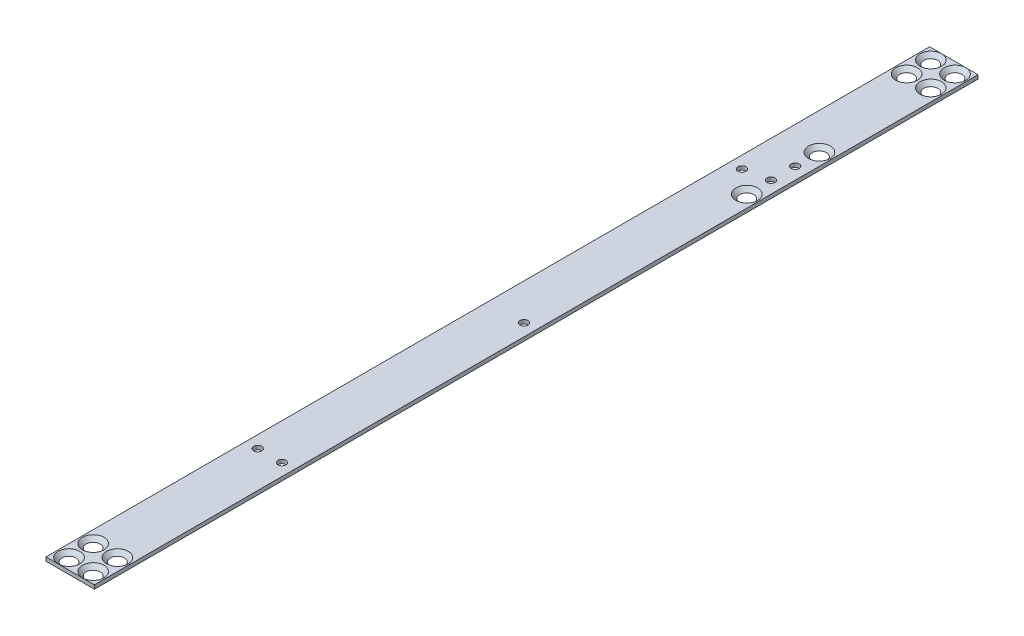
ISO-10303-21;
HEADER;
FILE_DESCRIPTION(('STEP AP214'),'2;1');
FILE_NAME('part.step','',(''),(''),'','','');
FILE_SCHEMA(('AUTOMOTIVE_DESIGN { 1 0 10303 214 1 1 1 1 }'));
ENDSEC;
DATA;
#1=APPLICATION_CONTEXT('core data for automotive mechanical design processes');
#2=APPLICATION_PROTOCOL_DEFINITION('international standard','automotive_design',2000,#1);
#3=PRODUCT_CONTEXT('',#1,'mechanical');
#4=PRODUCT('Part','Part','',(#3));
#5=PRODUCT_RELATED_PRODUCT_CATEGORY('part','',(#4));
#6=PRODUCT_DEFINITION_FORMATION('','',#4);
#7=PRODUCT_DEFINITION_CONTEXT('part definition',#1,'design');
#8=PRODUCT_DEFINITION('design','',#6,#7);
#9=PRODUCT_DEFINITION_SHAPE('','',#8);
#10=(LENGTH_UNIT() NAMED_UNIT(*) SI_UNIT(.MILLI.,.METRE.));
#11=(NAMED_UNIT(*) PLANE_ANGLE_UNIT() SI_UNIT($,.RADIAN.));
#12=(NAMED_UNIT(*) SI_UNIT($,.STERADIAN.) SOLID_ANGLE_UNIT());
#13=UNCERTAINTY_MEASURE_WITH_UNIT(LENGTH_MEASURE(1.E-05),#10,'distance_accuracy_value','');
#14=(GEOMETRIC_REPRESENTATION_CONTEXT(3) GLOBAL_UNCERTAINTY_ASSIGNED_CONTEXT((#13)) GLOBAL_UNIT_ASSIGNED_CONTEXT((#10,
#11,#12)) REPRESENTATION_CONTEXT('',''));
#15=CARTESIAN_POINT('',(0.,0.,0.));
#16=DIRECTION('',(0.,0.,1.));
#17=DIRECTION('',(1.,0.,0.));
#18=AXIS2_PLACEMENT_3D('',#15,#16,#17);
#19=CARTESIAN_POINT('',(0.,1.5875,0.));
#20=DIRECTION('',(0.,-1.,0.));
#21=DIRECTION('',(0.,0.,-1.));
#22=AXIS2_PLACEMENT_3D('',#19,#20,#21);
#23=PLANE('',#22);
#24=CARTESIAN_POINT('',(-5.,1.5875,-100.));
#25=DIRECTION('',(0.,1.,0.));
#26=DIRECTION('',(0.,0.,1.));
#27=AXIS2_PLACEMENT_3D('',#24,#25,#26);
#28=CIRCLE('',#27,1.65);
#29=CARTESIAN_POINT('',(-5.,1.5875,-98.35));
#30=VERTEX_POINT('',#29);
#31=EDGE_CURVE('E307',#30,#30,#28,.T.);
#32=ORIENTED_EDGE('',*,*,#31,.F.);
#33=EDGE_LOOP('',(#32));
#34=FACE_BOUND('',#33,.T.);
#35=CARTESIAN_POINT('',(5.,1.5875,0.));
#36=DIRECTION('',(0.,1.,0.));
#37=DIRECTION('',(0.,0.,1.));
#38=AXIS2_PLACEMENT_3D('',#35,#36,#37);
#39=CIRCLE('',#38,1.65);
#40=CARTESIAN_POINT('',(5.,1.5875,1.65));
#41=VERTEX_POINT('',#40);
#42=EDGE_CURVE('E268',#41,#41,#39,.T.);
#43=ORIENTED_EDGE('',*,*,#42,.F.);
#44=EDGE_LOOP('',(#43));
#45=FACE_BOUND('',#44,.T.);
#46=CARTESIAN_POINT('',(5.,1.5875,-112.));
#47=DIRECTION('',(0.,1.,0.));
#48=DIRECTION('',(0.,0.,1.));
#49=AXIS2_PLACEMENT_3D('',#46,#47,#48);
#50=CIRCLE('',#49,1.65);
#51=CARTESIAN_POINT('',(5.,1.5875,-110.35));
#52=VERTEX_POINT('',#51);
#53=EDGE_CURVE('E281',#52,#52,#50,.T.);
#54=ORIENTED_EDGE('',*,*,#53,.F.);
#55=EDGE_LOOP('',(#54));
#56=FACE_BOUND('',#55,.T.);
#57=CARTESIAN_POINT('',(-5.00000000000001,1.5875,168.));
#58=DIRECTION('',(0.,1.,0.));
#59=DIRECTION('',(0.,0.,1.));
#60=AXIS2_PLACEMENT_3D('',#57,#58,#59);
#61=CIRCLE('',#60,4.48);
#62=CARTESIAN_POINT('',(-5.00000000000001,1.5875,172.48));
#63=VERTEX_POINT('',#62);
#64=EDGE_CURVE('E147',#63,#63,#61,.T.);
#65=ORIENTED_EDGE('',*,*,#64,.F.);
#66=EDGE_LOOP('',(#65));
#67=FACE_BOUND('',#66,.T.);
#68=CARTESIAN_POINT('',(5.,1.5875,178.));
#69=DIRECTION('',(0.,1.,0.));
#70=DIRECTION('',(0.,0.,1.));
#71=AXIS2_PLACEMENT_3D('',#68,#69,#70);
#72=CIRCLE('',#71,4.48);
#73=CARTESIAN_POINT('',(5.,1.5875,182.48));
#74=VERTEX_POINT('',#73);
#75=EDGE_CURVE('E143',#74,#74,#72,.T.);
#76=ORIENTED_EDGE('',*,*,#75,.F.);
#77=EDGE_LOOP('',(#76));
#78=FACE_BOUND('',#77,.T.);
#79=CARTESIAN_POINT('',(-5.00000000000001,1.5875,-168.));
#80=DIRECTION('',(0.,1.,0.));
#81=DIRECTION('',(0.,0.,1.));
#82=AXIS2_PLACEMENT_3D('',#79,#80,#81);
#83=CIRCLE('',#82,4.48);
#84=CARTESIAN_POINT('',(-5.00000000000001,1.5875,-163.52));
#85=VERTEX_POINT('',#84);
#86=EDGE_CURVE('E179',#85,#85,#83,.T.);
#87=ORIENTED_EDGE('',*,*,#86,.F.);
#88=EDGE_LOOP('',(#87));
#89=FACE_BOUND('',#88,.T.);
#90=CARTESIAN_POINT('',(-5.00000000000001,1.5875,-178.));
#91=DIRECTION('',(0.,1.,0.));
#92=DIRECTION('',(0.,0.,1.));
#93=AXIS2_PLACEMENT_3D('',#90,#91,#92);
#94=CIRCLE('',#93,4.48);
#95=CARTESIAN_POINT('',(-5.00000000000001,1.5875,-173.52));
#96=VERTEX_POINT('',#95);
#97=EDGE_CURVE('E187',#96,#96,#94,.T.);
#98=ORIENTED_EDGE('',*,*,#97,.F.);
#99=EDGE_LOOP('',(#98));
#100=FACE_BOUND('',#99,.T.);
#101=CARTESIAN_POINT('',(5.,1.5875,-168.));
#102=DIRECTION('',(0.,1.,0.));
#103=DIRECTION('',(0.,0.,1.));
#104=AXIS2_PLACEMENT_3D('',#101,#102,#103);
#105=CIRCLE('',#104,4.48);
#106=CARTESIAN_POINT('',(5.,1.5875,-163.52));
#107=VERTEX_POINT('',#106);
#108=EDGE_CURVE('E195',#107,#107,#105,.T.);
#109=ORIENTED_EDGE('',*,*,#108,.F.);
#110=EDGE_LOOP('',(#109));
#111=FACE_BOUND('',#110,.T.);
#112=CARTESIAN_POINT('',(5.,1.5875,-122.));
#113=DIRECTION('',(0.,1.,0.));
#114=DIRECTION('',(0.,0.,1.));
#115=AXIS2_PLACEMENT_3D('',#112,#113,#114);
#116=CIRCLE('',#115,4.48);
#117=CARTESIAN_POINT('',(5.,1.5875,-117.52));
#118=VERTEX_POINT('',#117);
#119=EDGE_CURVE('E133',#118,#118,#116,.T.);
#120=ORIENTED_EDGE('',*,*,#119,.F.);
#121=EDGE_LOOP('',(#120));
#122=FACE_BOUND('',#121,.T.);
#123=DIRECTION('',(0.,0.,-1.));
#124=VECTOR('',#123,1.);
#125=CARTESIAN_POINT('',(10.,1.5875,182.5));
#126=LINE('',#125,#124);
#127=CARTESIAN_POINT('',(10.,1.5875,182.5));
#128=VERTEX_POINT('',#127);
#129=CARTESIAN_POINT('',(10.,1.5875,-182.5));
#130=VERTEX_POINT('',#129);
#131=EDGE_CURVE('E98',#128,#130,#126,.T.);
#132=ORIENTED_EDGE('',*,*,#131,.T.);
#133=DIRECTION('',(-1.,0.,0.));
#134=VECTOR('',#133,1.);
#135=CARTESIAN_POINT('',(-10.,1.5875,-182.5));
#136=LINE('',#135,#134);
#137=CARTESIAN_POINT('',(-10.,1.5875,-182.5));
#138=VERTEX_POINT('',#137);
#139=EDGE_CURVE('E93',#130,#138,#136,.T.);
#140=ORIENTED_EDGE('',*,*,#139,.T.);
#141=DIRECTION('',(0.,0.,1.));
#142=VECTOR('',#141,1.);
#143=CARTESIAN_POINT('',(-10.,1.5875,182.5));
#144=LINE('',#143,#142);
#145=CARTESIAN_POINT('',(-10.,1.5875,182.5));
#146=VERTEX_POINT('',#145);
#147=EDGE_CURVE('E96',#138,#146,#144,.T.);
#148=ORIENTED_EDGE('',*,*,#147,.T.);
#149=DIRECTION('',(1.,0.,0.));
#150=VECTOR('',#149,1.);
#151=CARTESIAN_POINT('',(-10.,1.5875,182.5));
#152=LINE('',#151,#150);
#153=EDGE_CURVE('E63',#146,#128,#152,.T.);
#154=ORIENTED_EDGE('',*,*,#153,.T.);
#155=EDGE_LOOP('',(#132,#140,#148,#154));
#156=FACE_BOUND('',#155,.T.);
#157=CARTESIAN_POINT('',(5.,1.5875,-92.));
#158=DIRECTION('',(0.,1.,0.));
#159=DIRECTION('',(0.,0.,1.));
#160=AXIS2_PLACEMENT_3D('',#157,#158,#159);
#161=CIRCLE('',#160,4.48);
#162=CARTESIAN_POINT('',(5.,1.5875,-87.52));
#163=VERTEX_POINT('',#162);
#164=EDGE_CURVE('E138',#163,#163,#161,.T.);
#165=ORIENTED_EDGE('',*,*,#164,.F.);
#166=EDGE_LOOP('',(#165));
#167=FACE_BOUND('',#166,.T.);
#168=CARTESIAN_POINT('',(5.,1.5875,-178.));
#169=DIRECTION('',(0.,1.,0.));
#170=DIRECTION('',(0.,0.,1.));
#171=AXIS2_PLACEMENT_3D('',#168,#169,#170);
#172=CIRCLE('',#171,4.48);
#173=CARTESIAN_POINT('',(5.,1.5875,-173.52));
#174=VERTEX_POINT('',#173);
#175=EDGE_CURVE('E142',#174,#174,#172,.T.);
#176=ORIENTED_EDGE('',*,*,#175,.F.);
#177=EDGE_LOOP('',(#176));
#178=FACE_BOUND('',#177,.T.);
#179=CARTESIAN_POINT('',(-5.00000000000001,1.5875,178.));
#180=DIRECTION('',(0.,1.,0.));
#181=DIRECTION('',(0.,0.,1.));
#182=AXIS2_PLACEMENT_3D('',#179,#180,#181);
#183=CIRCLE('',#182,4.48);
#184=CARTESIAN_POINT('',(-5.00000000000001,1.5875,182.48));
#185=VERTEX_POINT('',#184);
#186=EDGE_CURVE('E148',#185,#185,#183,.T.);
#187=ORIENTED_EDGE('',*,*,#186,.F.);
#188=EDGE_LOOP('',(#187));
#189=FACE_BOUND('',#188,.T.);
#190=CARTESIAN_POINT('',(5.,1.5875,168.));
#191=DIRECTION('',(0.,1.,0.));
#192=DIRECTION('',(0.,0.,1.));
#193=AXIS2_PLACEMENT_3D('',#190,#191,#192);
#194=CIRCLE('',#193,4.48);
#195=CARTESIAN_POINT('',(5.,1.5875,172.48));
#196=VERTEX_POINT('',#195);
#197=EDGE_CURVE('E162',#196,#196,#194,.T.);
#198=ORIENTED_EDGE('',*,*,#197,.F.);
#199=EDGE_LOOP('',(#198));
#200=FACE_BOUND('',#199,.T.);
#201=CARTESIAN_POINT('',(5.,1.5875,-102.));
#202=DIRECTION('',(0.,1.,0.));
#203=DIRECTION('',(0.,0.,1.));
#204=AXIS2_PLACEMENT_3D('',#201,#202,#203);
#205=CIRCLE('',#204,1.65);
#206=CARTESIAN_POINT('',(5.,1.5875,-100.35));
#207=VERTEX_POINT('',#206);
#208=EDGE_CURVE('E267',#207,#207,#205,.T.);
#209=ORIENTED_EDGE('',*,*,#208,.F.);
#210=EDGE_LOOP('',(#209));
#211=FACE_BOUND('',#210,.T.);
#212=CARTESIAN_POINT('',(5.,1.5875,100.));
#213=DIRECTION('',(0.,1.,0.));
#214=DIRECTION('',(0.,0.,1.));
#215=AXIS2_PLACEMENT_3D('',#212,#213,#214);
#216=CIRCLE('',#215,1.65);
#217=CARTESIAN_POINT('',(5.,1.5875,101.65));
#218=VERTEX_POINT('',#217);
#219=EDGE_CURVE('E297',#218,#218,#216,.T.);
#220=ORIENTED_EDGE('',*,*,#219,.F.);
#221=EDGE_LOOP('',(#220));
#222=FACE_BOUND('',#221,.T.);
#223=CARTESIAN_POINT('',(-5.,1.5875,100.));
#224=DIRECTION('',(0.,1.,0.));
#225=DIRECTION('',(0.,0.,1.));
#226=AXIS2_PLACEMENT_3D('',#223,#224,#225);
#227=CIRCLE('',#226,1.65);
#228=CARTESIAN_POINT('',(-5.,1.5875,101.65));
#229=VERTEX_POINT('',#228);
#230=EDGE_CURVE('E300',#229,#229,#227,.T.);
#231=ORIENTED_EDGE('',*,*,#230,.F.);
#232=EDGE_LOOP('',(#231));
#233=FACE_BOUND('',#232,.T.);
#234=ADVANCED_FACE('F43',(#34,#45,#56,#67,#78,#89,#100,#111,#122,#156,#167,#178,#189,#200,#211,
#222,#233),#23,.F.);
#235=CARTESIAN_POINT('',(0.,0.,0.));
#236=DIRECTION('',(0.,-1.,0.));
#237=DIRECTION('',(0.,0.,-1.));
#238=AXIS2_PLACEMENT_3D('',#235,#236,#237);
#239=PLANE('',#238);
#240=CARTESIAN_POINT('',(-5.,0.,100.));
#241=DIRECTION('',(0.,1.,0.));
#242=DIRECTION('',(0.,0.,1.));
#243=AXIS2_PLACEMENT_3D('',#240,#241,#242);
#244=CIRCLE('',#243,1.65);
#245=CARTESIAN_POINT('',(-5.,0.,101.65));
#246=VERTEX_POINT('',#245);
#247=EDGE_CURVE('E303',#246,#246,#244,.T.);
#248=ORIENTED_EDGE('',*,*,#247,.T.);
#249=EDGE_LOOP('',(#248));
#250=FACE_BOUND('',#249,.T.);
#251=CARTESIAN_POINT('',(-5.,0.,-100.));
#252=DIRECTION('',(0.,1.,0.));
#253=DIRECTION('',(0.,0.,1.));
#254=AXIS2_PLACEMENT_3D('',#251,#252,#253);
#255=CIRCLE('',#254,1.65);
#256=CARTESIAN_POINT('',(-5.,0.,-98.35));
#257=VERTEX_POINT('',#256);
#258=EDGE_CURVE('E313',#257,#257,#255,.T.);
#259=ORIENTED_EDGE('',*,*,#258,.T.);
#260=EDGE_LOOP('',(#259));
#261=FACE_BOUND('',#260,.T.);
#262=CARTESIAN_POINT('',(5.,0.,100.));
#263=DIRECTION('',(0.,1.,0.));
#264=DIRECTION('',(0.,0.,1.));
#265=AXIS2_PLACEMENT_3D('',#262,#263,#264);
#266=CIRCLE('',#265,1.65);
#267=CARTESIAN_POINT('',(5.,0.,101.65));
#268=VERTEX_POINT('',#267);
#269=EDGE_CURVE('E275',#268,#268,#266,.T.);
#270=ORIENTED_EDGE('',*,*,#269,.T.);
#271=EDGE_LOOP('',(#270));
#272=FACE_BOUND('',#271,.T.);
#273=CARTESIAN_POINT('',(5.,0.,178.));
#274=DIRECTION('',(0.,-1.,0.));
#275=DIRECTION('',(0.,0.,-1.));
#276=AXIS2_PLACEMENT_3D('',#273,#274,#275);
#277=CIRCLE('',#276,2.8925);
#278=CARTESIAN_POINT('',(5.,0.,175.1075));
#279=VERTEX_POINT('',#278);
#280=EDGE_CURVE('E139',#279,#279,#277,.T.);
#281=ORIENTED_EDGE('',*,*,#280,.F.);
#282=EDGE_LOOP('',(#281));
#283=FACE_BOUND('',#282,.T.);
#284=CARTESIAN_POINT('',(5.,0.,-168.));
#285=DIRECTION('',(0.,-1.,0.));
#286=DIRECTION('',(0.,0.,-1.));
#287=AXIS2_PLACEMENT_3D('',#284,#285,#286);
#288=CIRCLE('',#287,2.8925);
#289=CARTESIAN_POINT('',(5.,0.,-170.8925));
#290=VERTEX_POINT('',#289);
#291=EDGE_CURVE('E199',#290,#290,#288,.T.);
#292=ORIENTED_EDGE('',*,*,#291,.F.);
#293=EDGE_LOOP('',(#292));
#294=FACE_BOUND('',#293,.T.);
#295=CARTESIAN_POINT('',(5.,0.,-122.));
#296=DIRECTION('',(0.,-1.,0.));
#297=DIRECTION('',(0.,0.,-1.));
#298=AXIS2_PLACEMENT_3D('',#295,#296,#297);
#299=CIRCLE('',#298,2.8925);
#300=CARTESIAN_POINT('',(5.,0.,-124.8925));
#301=VERTEX_POINT('',#300);
#302=EDGE_CURVE('E119',#301,#301,#299,.T.);
#303=ORIENTED_EDGE('',*,*,#302,.F.);
#304=EDGE_LOOP('',(#303));
#305=FACE_BOUND('',#304,.T.);
#306=DIRECTION('',(0.,0.,-1.));
#307=VECTOR('',#306,1.);
#308=CARTESIAN_POINT('',(10.,0.,182.5));
#309=LINE('',#308,#307);
#310=CARTESIAN_POINT('',(10.,0.,182.5));
#311=VERTEX_POINT('',#310);
#312=CARTESIAN_POINT('',(10.,0.,-182.5));
#313=VERTEX_POINT('',#312);
#314=EDGE_CURVE('E115',#311,#313,#309,.T.);
#315=ORIENTED_EDGE('',*,*,#314,.F.);
#316=DIRECTION('',(1.,0.,0.));
#317=VECTOR('',#316,1.);
#318=CARTESIAN_POINT('',(-10.,0.,182.5));
#319=LINE('',#318,#317);
#320=CARTESIAN_POINT('',(-10.,0.,182.5));
#321=VERTEX_POINT('',#320);
#322=EDGE_CURVE('E86',#321,#311,#319,.T.);
#323=ORIENTED_EDGE('',*,*,#322,.F.);
#324=DIRECTION('',(0.,0.,1.));
#325=VECTOR('',#324,1.);
#326=CARTESIAN_POINT('',(-10.,0.,182.5));
#327=LINE('',#326,#325);
#328=CARTESIAN_POINT('',(-10.,0.,-182.5));
#329=VERTEX_POINT('',#328);
#330=EDGE_CURVE('E80',#329,#321,#327,.T.);
#331=ORIENTED_EDGE('',*,*,#330,.F.);
#332=DIRECTION('',(-1.,0.,0.));
#333=VECTOR('',#332,1.);
#334=CARTESIAN_POINT('',(-10.,0.,-182.5));
#335=LINE('',#334,#333);
#336=EDGE_CURVE('E103',#313,#329,#335,.T.);
#337=ORIENTED_EDGE('',*,*,#336,.F.);
#338=EDGE_LOOP('',(#315,#323,#331,#337));
#339=FACE_BOUND('',#338,.T.);
#340=CARTESIAN_POINT('',(5.,0.,-92.));
#341=DIRECTION('',(0.,-1.,0.));
#342=DIRECTION('',(0.,0.,-1.));
#343=AXIS2_PLACEMENT_3D('',#340,#341,#342);
#344=CIRCLE('',#343,2.8925);
#345=CARTESIAN_POINT('',(5.,0.,-94.8925));
#346=VERTEX_POINT('',#345);
#347=EDGE_CURVE('E134',#346,#346,#344,.T.);
#348=ORIENTED_EDGE('',*,*,#347,.F.);
#349=EDGE_LOOP('',(#348));
#350=FACE_BOUND('',#349,.T.);
#351=CARTESIAN_POINT('',(-5.00000000000001,0.,-178.));
#352=DIRECTION('',(0.,-1.,0.));
#353=DIRECTION('',(0.,0.,-1.));
#354=AXIS2_PLACEMENT_3D('',#351,#352,#353);
#355=CIRCLE('',#354,2.8925);
#356=CARTESIAN_POINT('',(-5.00000000000001,0.,-180.8925));
#357=VERTEX_POINT('',#356);
#358=EDGE_CURVE('E191',#357,#357,#355,.T.);
#359=ORIENTED_EDGE('',*,*,#358,.F.);
#360=EDGE_LOOP('',(#359));
#361=FACE_BOUND('',#360,.T.);
#362=CARTESIAN_POINT('',(-5.00000000000001,0.,-168.));
#363=DIRECTION('',(0.,-1.,0.));
#364=DIRECTION('',(0.,0.,-1.));
#365=AXIS2_PLACEMENT_3D('',#362,#363,#364);
#366=CIRCLE('',#365,2.8925);
#367=CARTESIAN_POINT('',(-5.00000000000001,0.,-170.8925));
#368=VERTEX_POINT('',#367);
#369=EDGE_CURVE('E183',#368,#368,#366,.T.);
#370=ORIENTED_EDGE('',*,*,#369,.F.);
#371=EDGE_LOOP('',(#370));
#372=FACE_BOUND('',#371,.T.);
#373=CARTESIAN_POINT('',(5.,0.,-178.));
#374=DIRECTION('',(0.,-1.,0.));
#375=DIRECTION('',(0.,0.,-1.));
#376=AXIS2_PLACEMENT_3D('',#373,#374,#375);
#377=CIRCLE('',#376,2.8925);
#378=CARTESIAN_POINT('',(5.,0.,-180.8925));
#379=VERTEX_POINT('',#378);
#380=EDGE_CURVE('E175',#379,#379,#377,.T.);
#381=ORIENTED_EDGE('',*,*,#380,.F.);
#382=EDGE_LOOP('',(#381));
#383=FACE_BOUND('',#382,.T.);
#384=CARTESIAN_POINT('',(-5.00000000000001,0.,168.));
#385=DIRECTION('',(0.,-1.,0.));
#386=DIRECTION('',(0.,0.,-1.));
#387=AXIS2_PLACEMENT_3D('',#384,#385,#386);
#388=CIRCLE('',#387,2.8925);
#389=CARTESIAN_POINT('',(-5.00000000000001,0.,165.1075));
#390=VERTEX_POINT('',#389);
#391=EDGE_CURVE('E154',#390,#390,#388,.T.);
#392=ORIENTED_EDGE('',*,*,#391,.F.);
#393=EDGE_LOOP('',(#392));
#394=FACE_BOUND('',#393,.T.);
#395=CARTESIAN_POINT('',(-5.00000000000001,0.,178.));
#396=DIRECTION('',(0.,-1.,0.));
#397=DIRECTION('',(0.,0.,-1.));
#398=AXIS2_PLACEMENT_3D('',#395,#396,#397);
#399=CIRCLE('',#398,2.8925);
#400=CARTESIAN_POINT('',(-5.00000000000001,0.,175.1075));
#401=VERTEX_POINT('',#400);
#402=EDGE_CURVE('E144',#401,#401,#399,.T.);
#403=ORIENTED_EDGE('',*,*,#402,.F.);
#404=EDGE_LOOP('',(#403));
#405=FACE_BOUND('',#404,.T.);
#406=CARTESIAN_POINT('',(5.,0.,168.));
#407=DIRECTION('',(0.,-1.,0.));
#408=DIRECTION('',(0.,0.,-1.));
#409=AXIS2_PLACEMENT_3D('',#406,#407,#408);
#410=CIRCLE('',#409,2.8925);
#411=CARTESIAN_POINT('',(5.,0.,165.1075));
#412=VERTEX_POINT('',#411);
#413=EDGE_CURVE('E47',#412,#412,#410,.T.);
#414=ORIENTED_EDGE('',*,*,#413,.F.);
#415=EDGE_LOOP('',(#414));
#416=FACE_BOUND('',#415,.T.);
#417=CARTESIAN_POINT('',(5.,0.,-112.));
#418=DIRECTION('',(0.,1.,0.));
#419=DIRECTION('',(0.,0.,1.));
#420=AXIS2_PLACEMENT_3D('',#417,#418,#419);
#421=CIRCLE('',#420,1.65);
#422=CARTESIAN_POINT('',(5.,0.,-110.35));
#423=VERTEX_POINT('',#422);
#424=EDGE_CURVE('E257',#423,#423,#421,.T.);
#425=ORIENTED_EDGE('',*,*,#424,.T.);
#426=EDGE_LOOP('',(#425));
#427=FACE_BOUND('',#426,.T.);
#428=CARTESIAN_POINT('',(5.,0.,-102.));
#429=DIRECTION('',(0.,1.,0.));
#430=DIRECTION('',(0.,0.,1.));
#431=AXIS2_PLACEMENT_3D('',#428,#429,#430);
#432=CIRCLE('',#431,1.65);
#433=CARTESIAN_POINT('',(5.,0.,-100.35));
#434=VERTEX_POINT('',#433);
#435=EDGE_CURVE('E261',#434,#434,#432,.T.);
#436=ORIENTED_EDGE('',*,*,#435,.T.);
#437=EDGE_LOOP('',(#436));
#438=FACE_BOUND('',#437,.T.);
#439=CARTESIAN_POINT('',(5.,0.,0.));
#440=DIRECTION('',(0.,1.,0.));
#441=DIRECTION('',(0.,0.,1.));
#442=AXIS2_PLACEMENT_3D('',#439,#440,#441);
#443=CIRCLE('',#442,1.65);
#444=CARTESIAN_POINT('',(5.,0.,1.65));
#445=VERTEX_POINT('',#444);
#446=EDGE_CURVE('E264',#445,#445,#443,.T.);
#447=ORIENTED_EDGE('',*,*,#446,.T.);
#448=EDGE_LOOP('',(#447));
#449=FACE_BOUND('',#448,.T.);
#450=ADVANCED_FACE('F214',(#250,#261,#272,#283,#294,#305,#339,#350,#361,#372,#383,#394,#405,
#416,#427,#438,#449),#239,.T.);
#451=CARTESIAN_POINT('',(10.,1.5875,182.5));
#452=DIRECTION('',(-1.,0.,0.));
#453=DIRECTION('',(0.,0.,1.));
#454=AXIS2_PLACEMENT_3D('',#451,#452,#453);
#455=PLANE('',#454);
#456=ORIENTED_EDGE('',*,*,#314,.T.);
#457=DIRECTION('',(0.,-1.,0.));
#458=VECTOR('',#457,1.);
#459=CARTESIAN_POINT('',(10.,1.5875,-182.5));
#460=LINE('',#459,#458);
#461=EDGE_CURVE('E11',#130,#313,#460,.T.);
#462=ORIENTED_EDGE('',*,*,#461,.F.);
#463=ORIENTED_EDGE('',*,*,#131,.F.);
#464=DIRECTION('',(0.,-1.,0.));
#465=VECTOR('',#464,1.);
#466=CARTESIAN_POINT('',(10.,1.5875,182.5));
#467=LINE('',#466,#465);
#468=EDGE_CURVE('E111',#128,#311,#467,.T.);
#469=ORIENTED_EDGE('',*,*,#468,.T.);
#470=EDGE_LOOP('',(#456,#462,#463,#469));
#471=FACE_BOUND('',#470,.T.);
#472=ADVANCED_FACE('F45',(#471),#455,.F.);
#473=CARTESIAN_POINT('',(-10.,1.5875,-182.5));
#474=DIRECTION('',(0.,0.,1.));
#475=DIRECTION('',(1.,0.,0.));
#476=AXIS2_PLACEMENT_3D('',#473,#474,#475);
#477=PLANE('',#476);
#478=ORIENTED_EDGE('',*,*,#336,.T.);
#479=DIRECTION('',(0.,-1.,0.));
#480=VECTOR('',#479,1.);
#481=CARTESIAN_POINT('',(-10.,1.5875,-182.5));
#482=LINE('',#481,#480);
#483=EDGE_CURVE('E54',#138,#329,#482,.T.);
#484=ORIENTED_EDGE('',*,*,#483,.F.);
#485=ORIENTED_EDGE('',*,*,#139,.F.);
#486=ORIENTED_EDGE('',*,*,#461,.T.);
#487=EDGE_LOOP('',(#478,#484,#485,#486));
#488=FACE_BOUND('',#487,.T.);
#489=ADVANCED_FACE('F102',(#488),#477,.F.);
#490=CARTESIAN_POINT('',(-10.,1.5875,182.5));
#491=DIRECTION('',(1.,0.,0.));
#492=DIRECTION('',(0.,0.,-1.));
#493=AXIS2_PLACEMENT_3D('',#490,#491,#492);
#494=PLANE('',#493);
#495=ORIENTED_EDGE('',*,*,#330,.T.);
#496=DIRECTION('',(0.,-1.,0.));
#497=VECTOR('',#496,1.);
#498=CARTESIAN_POINT('',(-10.,1.5875,182.5));
#499=LINE('',#498,#497);
#500=EDGE_CURVE('E105',#146,#321,#499,.T.);
#501=ORIENTED_EDGE('',*,*,#500,.F.);
#502=ORIENTED_EDGE('',*,*,#147,.F.);
#503=ORIENTED_EDGE('',*,*,#483,.T.);
#504=EDGE_LOOP('',(#495,#501,#502,#503));
#505=FACE_BOUND('',#504,.T.);
#506=ADVANCED_FACE('F107',(#505),#494,.F.);
#507=CARTESIAN_POINT('',(-10.,1.5875,182.5));
#508=DIRECTION('',(0.,0.,-1.));
#509=DIRECTION('',(-1.,0.,0.));
#510=AXIS2_PLACEMENT_3D('',#507,#508,#509);
#511=PLANE('',#510);
#512=ORIENTED_EDGE('',*,*,#322,.T.);
#513=ORIENTED_EDGE('',*,*,#468,.F.);
#514=ORIENTED_EDGE('',*,*,#153,.F.);
#515=ORIENTED_EDGE('',*,*,#500,.T.);
#516=EDGE_LOOP('',(#512,#513,#514,#515));
#517=FACE_BOUND('',#516,.T.);
#518=ADVANCED_FACE('F227',(#517),#511,.F.);
#519=CARTESIAN_POINT('',(5.,1.5875,-122.));
#520=DIRECTION('',(0.,1.,0.));
#521=DIRECTION('',(0.,0.,1.));
#522=AXIS2_PLACEMENT_3D('',#519,#520,#521);
#523=CONICAL_SURFACE('',#522,4.48,0.785398163397449);
#524=ORIENTED_EDGE('',*,*,#302,.T.);
#525=EDGE_LOOP('',(#524));
#526=FACE_BOUND('',#525,.T.);
#527=ORIENTED_EDGE('',*,*,#119,.T.);
#528=EDGE_LOOP('',(#527));
#529=FACE_BOUND('',#528,.T.);
#530=ADVANCED_FACE('F211',(#526,#529),#523,.F.);
#531=CARTESIAN_POINT('',(5.,1.5875,-92.));
#532=DIRECTION('',(0.,1.,0.));
#533=DIRECTION('',(0.,0.,1.));
#534=AXIS2_PLACEMENT_3D('',#531,#532,#533);
#535=CONICAL_SURFACE('',#534,4.48,0.785398163397448);
#536=ORIENTED_EDGE('',*,*,#347,.T.);
#537=EDGE_LOOP('',(#536));
#538=FACE_BOUND('',#537,.T.);
#539=ORIENTED_EDGE('',*,*,#164,.T.);
#540=EDGE_LOOP('',(#539));
#541=FACE_BOUND('',#540,.T.);
#542=ADVANCED_FACE('F376',(#538,#541),#535,.F.);
#543=CARTESIAN_POINT('',(5.,1.5875,-168.));
#544=DIRECTION('',(0.,1.,0.));
#545=DIRECTION('',(0.,0.,1.));
#546=AXIS2_PLACEMENT_3D('',#543,#544,#545);
#547=CONICAL_SURFACE('',#546,4.48,0.785398163397448);
#548=ORIENTED_EDGE('',*,*,#291,.T.);
#549=EDGE_LOOP('',(#548));
#550=FACE_BOUND('',#549,.T.);
#551=ORIENTED_EDGE('',*,*,#108,.T.);
#552=EDGE_LOOP('',(#551));
#553=FACE_BOUND('',#552,.T.);
#554=ADVANCED_FACE('F373',(#550,#553),#547,.F.);
#555=CARTESIAN_POINT('',(-5.00000000000001,1.5875,-178.));
#556=DIRECTION('',(0.,1.,0.));
#557=DIRECTION('',(0.,0.,1.));
#558=AXIS2_PLACEMENT_3D('',#555,#556,#557);
#559=CONICAL_SURFACE('',#558,4.48,0.785398163397449);
#560=ORIENTED_EDGE('',*,*,#358,.T.);
#561=EDGE_LOOP('',(#560));
#562=FACE_BOUND('',#561,.T.);
#563=ORIENTED_EDGE('',*,*,#97,.T.);
#564=EDGE_LOOP('',(#563));
#565=FACE_BOUND('',#564,.T.);
#566=ADVANCED_FACE('F369',(#562,#565),#559,.F.);
#567=CARTESIAN_POINT('',(-5.00000000000001,1.5875,-168.));
#568=DIRECTION('',(0.,1.,0.));
#569=DIRECTION('',(0.,0.,1.));
#570=AXIS2_PLACEMENT_3D('',#567,#568,#569);
#571=CONICAL_SURFACE('',#570,4.48,0.785398163397449);
#572=ORIENTED_EDGE('',*,*,#369,.T.);
#573=EDGE_LOOP('',(#572));
#574=FACE_BOUND('',#573,.T.);
#575=ORIENTED_EDGE('',*,*,#86,.T.);
#576=EDGE_LOOP('',(#575));
#577=FACE_BOUND('',#576,.T.);
#578=ADVANCED_FACE('F365',(#574,#577),#571,.F.);
#579=CARTESIAN_POINT('',(5.,1.5875,-178.));
#580=DIRECTION('',(0.,1.,0.));
#581=DIRECTION('',(0.,0.,1.));
#582=AXIS2_PLACEMENT_3D('',#579,#580,#581);
#583=CONICAL_SURFACE('',#582,4.48,0.785398163397448);
#584=ORIENTED_EDGE('',*,*,#380,.T.);
#585=EDGE_LOOP('',(#584));
#586=FACE_BOUND('',#585,.T.);
#587=ORIENTED_EDGE('',*,*,#175,.T.);
#588=EDGE_LOOP('',(#587));
#589=FACE_BOUND('',#588,.T.);
#590=ADVANCED_FACE('F361',(#586,#589),#583,.F.);
#591=CARTESIAN_POINT('',(5.,1.5875,178.));
#592=DIRECTION('',(0.,1.,0.));
#593=DIRECTION('',(0.,0.,1.));
#594=AXIS2_PLACEMENT_3D('',#591,#592,#593);
#595=CONICAL_SURFACE('',#594,4.48,0.785398163397448);
#596=ORIENTED_EDGE('',*,*,#280,.T.);
#597=EDGE_LOOP('',(#596));
#598=FACE_BOUND('',#597,.T.);
#599=ORIENTED_EDGE('',*,*,#75,.T.);
#600=EDGE_LOOP('',(#599));
#601=FACE_BOUND('',#600,.T.);
#602=ADVANCED_FACE('F357',(#598,#601),#595,.F.);
#603=CARTESIAN_POINT('',(-5.00000000000001,1.5875,168.));
#604=DIRECTION('',(0.,1.,0.));
#605=DIRECTION('',(0.,0.,1.));
#606=AXIS2_PLACEMENT_3D('',#603,#604,#605);
#607=CONICAL_SURFACE('',#606,4.48,0.785398163397449);
#608=ORIENTED_EDGE('',*,*,#391,.T.);
#609=EDGE_LOOP('',(#608));
#610=FACE_BOUND('',#609,.T.);
#611=ORIENTED_EDGE('',*,*,#64,.T.);
#612=EDGE_LOOP('',(#611));
#613=FACE_BOUND('',#612,.T.);
#614=ADVANCED_FACE('F354',(#610,#613),#607,.F.);
#615=CARTESIAN_POINT('',(-5.00000000000001,1.5875,178.));
#616=DIRECTION('',(0.,1.,0.));
#617=DIRECTION('',(0.,0.,1.));
#618=AXIS2_PLACEMENT_3D('',#615,#616,#617);
#619=CONICAL_SURFACE('',#618,4.48,0.785398163397449);
#620=ORIENTED_EDGE('',*,*,#402,.T.);
#621=EDGE_LOOP('',(#620));
#622=FACE_BOUND('',#621,.T.);
#623=ORIENTED_EDGE('',*,*,#186,.T.);
#624=EDGE_LOOP('',(#623));
#625=FACE_BOUND('',#624,.T.);
#626=ADVANCED_FACE('F350',(#622,#625),#619,.F.);
#627=CARTESIAN_POINT('',(5.,1.5875,168.));
#628=DIRECTION('',(0.,1.,0.));
#629=DIRECTION('',(0.,0.,1.));
#630=AXIS2_PLACEMENT_3D('',#627,#628,#629);
#631=CONICAL_SURFACE('',#630,4.48,0.785398163397448);
#632=ORIENTED_EDGE('',*,*,#413,.T.);
#633=EDGE_LOOP('',(#632));
#634=FACE_BOUND('',#633,.T.);
#635=ORIENTED_EDGE('',*,*,#197,.T.);
#636=EDGE_LOOP('',(#635));
#637=FACE_BOUND('',#636,.T.);
#638=ADVANCED_FACE('F289',(#634,#637),#631,.F.);
#639=CARTESIAN_POINT('',(5.,1.5875,-112.));
#640=DIRECTION('',(0.,1.,0.));
#641=DIRECTION('',(0.,0.,1.));
#642=AXIS2_PLACEMENT_3D('',#639,#640,#641);
#643=CYLINDRICAL_SURFACE('',#642,1.65);
#644=ORIENTED_EDGE('',*,*,#424,.F.);
#645=EDGE_LOOP('',(#644));
#646=FACE_BOUND('',#645,.T.);
#647=ORIENTED_EDGE('',*,*,#53,.T.);
#648=EDGE_LOOP('',(#647));
#649=FACE_BOUND('',#648,.T.);
#650=ADVANCED_FACE('F343',(#646,#649),#643,.F.);
#651=CARTESIAN_POINT('',(5.,1.5875,-102.));
#652=DIRECTION('',(0.,1.,0.));
#653=DIRECTION('',(0.,0.,1.));
#654=AXIS2_PLACEMENT_3D('',#651,#652,#653);
#655=CYLINDRICAL_SURFACE('',#654,1.65);
#656=ORIENTED_EDGE('',*,*,#435,.F.);
#657=EDGE_LOOP('',(#656));
#658=FACE_BOUND('',#657,.T.);
#659=ORIENTED_EDGE('',*,*,#208,.T.);
#660=EDGE_LOOP('',(#659));
#661=FACE_BOUND('',#660,.T.);
#662=ADVANCED_FACE('F337',(#658,#661),#655,.F.);
#663=CARTESIAN_POINT('',(5.,1.5875,0.));
#664=DIRECTION('',(0.,1.,0.));
#665=DIRECTION('',(0.,0.,1.));
#666=AXIS2_PLACEMENT_3D('',#663,#664,#665);
#667=CYLINDRICAL_SURFACE('',#666,1.65);
#668=ORIENTED_EDGE('',*,*,#446,.F.);
#669=EDGE_LOOP('',(#668));
#670=FACE_BOUND('',#669,.T.);
#671=ORIENTED_EDGE('',*,*,#42,.T.);
#672=EDGE_LOOP('',(#671));
#673=FACE_BOUND('',#672,.T.);
#674=ADVANCED_FACE('F328',(#670,#673),#667,.F.);
#675=CARTESIAN_POINT('',(5.,1.5875,100.));
#676=DIRECTION('',(0.,1.,0.));
#677=DIRECTION('',(0.,0.,1.));
#678=AXIS2_PLACEMENT_3D('',#675,#676,#677);
#679=CYLINDRICAL_SURFACE('',#678,1.65);
#680=ORIENTED_EDGE('',*,*,#269,.F.);
#681=EDGE_LOOP('',(#680));
#682=FACE_BOUND('',#681,.T.);
#683=ORIENTED_EDGE('',*,*,#219,.T.);
#684=EDGE_LOOP('',(#683));
#685=FACE_BOUND('',#684,.T.);
#686=ADVANCED_FACE('F324',(#682,#685),#679,.F.);
#687=CARTESIAN_POINT('',(-5.,1.5875,-100.));
#688=DIRECTION('',(0.,1.,0.));
#689=DIRECTION('',(0.,0.,1.));
#690=AXIS2_PLACEMENT_3D('',#687,#688,#689);
#691=CYLINDRICAL_SURFACE('',#690,1.65);
#692=ORIENTED_EDGE('',*,*,#258,.F.);
#693=EDGE_LOOP('',(#692));
#694=FACE_BOUND('',#693,.T.);
#695=ORIENTED_EDGE('',*,*,#31,.T.);
#696=EDGE_LOOP('',(#695));
#697=FACE_BOUND('',#696,.T.);
#698=ADVANCED_FACE('F327',(#694,#697),#691,.F.);
#699=CARTESIAN_POINT('',(-5.,1.5875,100.));
#700=DIRECTION('',(0.,1.,0.));
#701=DIRECTION('',(0.,0.,1.));
#702=AXIS2_PLACEMENT_3D('',#699,#700,#701);
#703=CYLINDRICAL_SURFACE('',#702,1.65);
#704=ORIENTED_EDGE('',*,*,#247,.F.);
#705=EDGE_LOOP('',(#704));
#706=FACE_BOUND('',#705,.T.);
#707=ORIENTED_EDGE('',*,*,#230,.T.);
#708=EDGE_LOOP('',(#707));
#709=FACE_BOUND('',#708,.T.);
#710=ADVANCED_FACE('F334',(#706,#709),#703,.F.);
#711=CLOSED_SHELL('',(#234,#450,#472,#489,#506,#518,#530,#542,#554,#566,#578,#590,#602,#614,
#626,#638,#650,#662,#674,#686,#698,#710));
#712=MANIFOLD_SOLID_BREP('B2',#711);
#713=ADVANCED_BREP_SHAPE_REPRESENTATION('',(#18,#712),#14);
#714=SHAPE_DEFINITION_REPRESENTATION(#9,#713);
ENDSEC;
END-ISO-10303-21;
